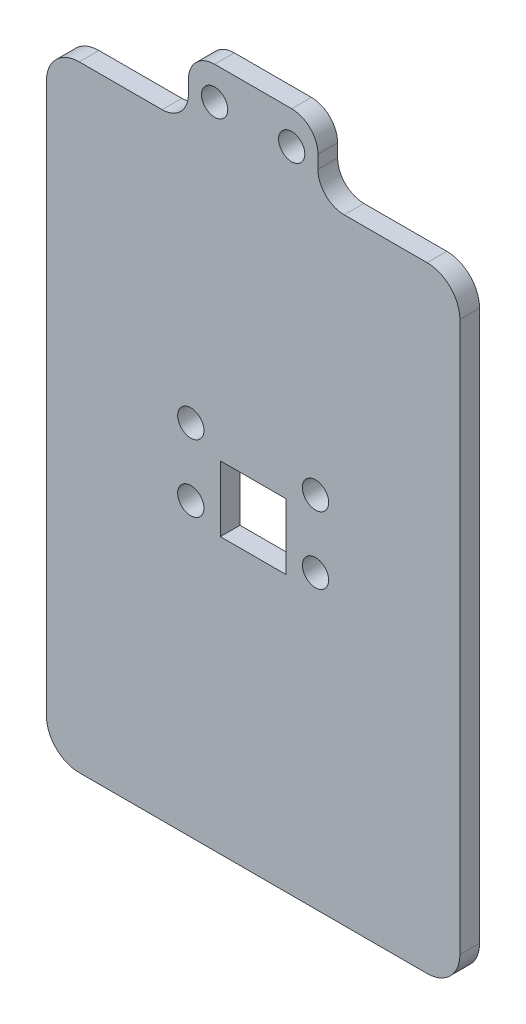
ISO-10303-21;
HEADER;
FILE_DESCRIPTION(('STEP AP214'),'2;1');
FILE_NAME('part.step','',(''),(''),'','','');
FILE_SCHEMA(('AUTOMOTIVE_DESIGN { 1 0 10303 214 1 1 1 1 }'));
ENDSEC;
DATA;
#1=APPLICATION_CONTEXT('core data for automotive mechanical design processes');
#2=APPLICATION_PROTOCOL_DEFINITION('international standard','automotive_design',2000,#1);
#3=PRODUCT_CONTEXT('',#1,'mechanical');
#4=PRODUCT('Part','Part','',(#3));
#5=PRODUCT_RELATED_PRODUCT_CATEGORY('part','',(#4));
#6=PRODUCT_DEFINITION_FORMATION('','',#4);
#7=PRODUCT_DEFINITION_CONTEXT('part definition',#1,'design');
#8=PRODUCT_DEFINITION('design','',#6,#7);
#9=PRODUCT_DEFINITION_SHAPE('','',#8);
#10=(LENGTH_UNIT() NAMED_UNIT(*) SI_UNIT(.MILLI.,.METRE.));
#11=(NAMED_UNIT(*) PLANE_ANGLE_UNIT() SI_UNIT($,.RADIAN.));
#12=(NAMED_UNIT(*) SI_UNIT($,.STERADIAN.) SOLID_ANGLE_UNIT());
#13=UNCERTAINTY_MEASURE_WITH_UNIT(LENGTH_MEASURE(1.E-05),#10,'distance_accuracy_value','');
#14=(GEOMETRIC_REPRESENTATION_CONTEXT(3) GLOBAL_UNCERTAINTY_ASSIGNED_CONTEXT((#13)) GLOBAL_UNIT_ASSIGNED_CONTEXT((#10,
#11,#12)) REPRESENTATION_CONTEXT('',''));
#15=CARTESIAN_POINT('',(0.,0.,0.));
#16=DIRECTION('',(0.,0.,1.));
#17=DIRECTION('',(1.,0.,0.));
#18=AXIS2_PLACEMENT_3D('',#15,#16,#17);
#19=CARTESIAN_POINT('',(-26.5,-41.9,3.));
#20=DIRECTION('',(0.,0.,-1.));
#21=DIRECTION('',(-1.,0.,0.));
#22=AXIS2_PLACEMENT_3D('',#19,#20,#21);
#23=PLANE('',#22);
#24=CARTESIAN_POINT('',(-9.50000000000001,7.75,3.));
#25=DIRECTION('',(0.,0.,1.));
#26=DIRECTION('',(1.,0.,0.));
#27=AXIS2_PLACEMENT_3D('',#24,#25,#26);
#28=CIRCLE('',#27,2.);
#29=CARTESIAN_POINT('',(-7.50000000000001,7.75,3.));
#30=VERTEX_POINT('',#29);
#31=EDGE_CURVE('E650',#30,#30,#28,.T.);
#32=ORIENTED_EDGE('',*,*,#31,.F.);
#33=EDGE_LOOP('',(#32));
#34=FACE_BOUND('',#33,.T.);
#35=CARTESIAN_POINT('',(9.49999999999999,-2.5,3.));
#36=DIRECTION('',(0.,0.,1.));
#37=DIRECTION('',(1.,0.,0.));
#38=AXIS2_PLACEMENT_3D('',#35,#36,#37);
#39=CIRCLE('',#38,2.);
#40=CARTESIAN_POINT('',(11.5,-2.5,3.));
#41=VERTEX_POINT('',#40);
#42=EDGE_CURVE('E662',#41,#41,#39,.T.);
#43=ORIENTED_EDGE('',*,*,#42,.F.);
#44=EDGE_LOOP('',(#43));
#45=FACE_BOUND('',#44,.T.);
#46=CARTESIAN_POINT('',(-5.86967980898232,51.9,3.));
#47=DIRECTION('',(0.,0.,1.));
#48=DIRECTION('',(1.,0.,0.));
#49=AXIS2_PLACEMENT_3D('',#46,#47,#48);
#50=CIRCLE('',#49,2.);
#51=CARTESIAN_POINT('',(-3.86967980898232,51.9,3.));
#52=VERTEX_POINT('',#51);
#53=EDGE_CURVE('E199',#52,#52,#50,.T.);
#54=ORIENTED_EDGE('',*,*,#53,.F.);
#55=EDGE_LOOP('',(#54));
#56=FACE_BOUND('',#55,.T.);
#57=CARTESIAN_POINT('',(-26.5,-41.9,3.));
#58=DIRECTION('',(0.,0.,1.));
#59=DIRECTION('',(-1.,0.,0.));
#60=AXIS2_PLACEMENT_3D('',#57,#58,#59);
#61=CIRCLE('',#60,5.);
#62=CARTESIAN_POINT('',(-31.5,-41.9,3.));
#63=VERTEX_POINT('',#62);
#64=CARTESIAN_POINT('',(-26.5,-46.9,3.));
#65=VERTEX_POINT('',#64);
#66=EDGE_CURVE('E209',#63,#65,#61,.T.);
#67=ORIENTED_EDGE('',*,*,#66,.T.);
#68=DIRECTION('',(1.,0.,0.));
#69=VECTOR('',#68,1.);
#70=CARTESIAN_POINT('',(-26.5,-46.9,3.));
#71=LINE('',#70,#69);
#72=CARTESIAN_POINT('',(26.5,-46.9,3.));
#73=VERTEX_POINT('',#72);
#74=EDGE_CURVE('E212',#65,#73,#71,.T.);
#75=ORIENTED_EDGE('',*,*,#74,.T.);
#76=CARTESIAN_POINT('',(26.5,-41.9,3.));
#77=DIRECTION('',(0.,0.,1.));
#78=DIRECTION('',(1.,0.,0.));
#79=AXIS2_PLACEMENT_3D('',#76,#77,#78);
#80=CIRCLE('',#79,5.);
#81=CARTESIAN_POINT('',(31.5,-41.9,3.));
#82=VERTEX_POINT('',#81);
#83=EDGE_CURVE('E215',#73,#82,#80,.T.);
#84=ORIENTED_EDGE('',*,*,#83,.T.);
#85=DIRECTION('',(0.,1.,0.));
#86=VECTOR('',#85,1.);
#87=CARTESIAN_POINT('',(31.5,-41.9,3.));
#88=LINE('',#87,#86);
#89=CARTESIAN_POINT('',(31.5,41.8999999999999,3.));
#90=VERTEX_POINT('',#89);
#91=EDGE_CURVE('E217',#82,#90,#88,.T.);
#92=ORIENTED_EDGE('',*,*,#91,.T.);
#93=CARTESIAN_POINT('',(26.5,41.9,3.));
#94=DIRECTION('',(0.,0.,1.));
#95=DIRECTION('',(-1.,0.,0.));
#96=AXIS2_PLACEMENT_3D('',#93,#94,#95);
#97=CIRCLE('',#96,5.);
#98=CARTESIAN_POINT('',(26.5,46.9,3.));
#99=VERTEX_POINT('',#98);
#100=EDGE_CURVE('E219',#90,#99,#97,.T.);
#101=ORIENTED_EDGE('',*,*,#100,.T.);
#102=DIRECTION('',(-1.,0.,0.));
#103=VECTOR('',#102,1.);
#104=CARTESIAN_POINT('',(13.8696798089823,46.9,3.));
#105=LINE('',#104,#103);
#106=CARTESIAN_POINT('',(13.8696798089823,46.9,3.));
#107=VERTEX_POINT('',#106);
#108=EDGE_CURVE('E221',#99,#107,#105,.T.);
#109=ORIENTED_EDGE('',*,*,#108,.T.);
#110=CARTESIAN_POINT('',(13.8696798089823,50.9,3.));
#111=DIRECTION('',(0.,0.,-1.));
#112=DIRECTION('',(-1.,0.,0.));
#113=AXIS2_PLACEMENT_3D('',#110,#111,#112);
#114=CIRCLE('',#113,4.);
#115=CARTESIAN_POINT('',(9.86967980898232,50.9,3.));
#116=VERTEX_POINT('',#115);
#117=EDGE_CURVE('E223',#107,#116,#114,.T.);
#118=ORIENTED_EDGE('',*,*,#117,.T.);
#119=DIRECTION('',(0.,1.,0.));
#120=VECTOR('',#119,1.);
#121=CARTESIAN_POINT('',(9.86967980898232,52.9,3.));
#122=LINE('',#121,#120);
#123=CARTESIAN_POINT('',(9.86967980898232,52.9,3.));
#124=VERTEX_POINT('',#123);
#125=EDGE_CURVE('E225',#116,#124,#122,.T.);
#126=ORIENTED_EDGE('',*,*,#125,.T.);
#127=CARTESIAN_POINT('',(5.86967980898232,52.9,3.));
#128=DIRECTION('',(0.,0.,1.));
#129=DIRECTION('',(-1.,0.,0.));
#130=AXIS2_PLACEMENT_3D('',#127,#128,#129);
#131=CIRCLE('',#130,4.);
#132=CARTESIAN_POINT('',(5.86967980898229,56.9,3.));
#133=VERTEX_POINT('',#132);
#134=EDGE_CURVE('E227',#124,#133,#131,.T.);
#135=ORIENTED_EDGE('',*,*,#134,.T.);
#136=DIRECTION('',(-1.,0.,0.));
#137=VECTOR('',#136,1.);
#138=CARTESIAN_POINT('',(-5.86967980898229,56.9,3.));
#139=LINE('',#138,#137);
#140=CARTESIAN_POINT('',(-5.86967980898229,56.9,3.));
#141=VERTEX_POINT('',#140);
#142=EDGE_CURVE('E229',#133,#141,#139,.T.);
#143=ORIENTED_EDGE('',*,*,#142,.T.);
#144=CARTESIAN_POINT('',(-5.86967980898232,52.9,3.));
#145=DIRECTION('',(0.,0.,1.));
#146=DIRECTION('',(1.,0.,0.));
#147=AXIS2_PLACEMENT_3D('',#144,#145,#146);
#148=CIRCLE('',#147,4.);
#149=CARTESIAN_POINT('',(-9.86967980898232,52.9,3.));
#150=VERTEX_POINT('',#149);
#151=EDGE_CURVE('E231',#141,#150,#148,.T.);
#152=ORIENTED_EDGE('',*,*,#151,.T.);
#153=DIRECTION('',(0.,-1.,0.));
#154=VECTOR('',#153,1.);
#155=CARTESIAN_POINT('',(-9.86967980898232,52.9,3.));
#156=LINE('',#155,#154);
#157=CARTESIAN_POINT('',(-9.86967980898232,50.9,3.));
#158=VERTEX_POINT('',#157);
#159=EDGE_CURVE('E233',#150,#158,#156,.T.);
#160=ORIENTED_EDGE('',*,*,#159,.T.);
#161=CARTESIAN_POINT('',(-13.8696798089823,50.9,3.));
#162=DIRECTION('',(0.,0.,-1.));
#163=DIRECTION('',(-1.,0.,0.));
#164=AXIS2_PLACEMENT_3D('',#161,#162,#163);
#165=CIRCLE('',#164,4.);
#166=CARTESIAN_POINT('',(-13.8696798089823,46.9,3.));
#167=VERTEX_POINT('',#166);
#168=EDGE_CURVE('E235',#158,#167,#165,.T.);
#169=ORIENTED_EDGE('',*,*,#168,.T.);
#170=DIRECTION('',(-1.,0.,0.));
#171=VECTOR('',#170,1.);
#172=CARTESIAN_POINT('',(-26.5,46.9,3.));
#173=LINE('',#172,#171);
#174=CARTESIAN_POINT('',(-26.5,46.9,3.));
#175=VERTEX_POINT('',#174);
#176=EDGE_CURVE('E237',#167,#175,#173,.T.);
#177=ORIENTED_EDGE('',*,*,#176,.T.);
#178=CARTESIAN_POINT('',(-26.5,41.9,3.));
#179=DIRECTION('',(0.,0.,1.));
#180=DIRECTION('',(-1.,0.,0.));
#181=AXIS2_PLACEMENT_3D('',#178,#179,#180);
#182=CIRCLE('',#181,5.);
#183=CARTESIAN_POINT('',(-31.5,41.8999999999999,3.));
#184=VERTEX_POINT('',#183);
#185=EDGE_CURVE('E239',#175,#184,#182,.T.);
#186=ORIENTED_EDGE('',*,*,#185,.T.);
#187=DIRECTION('',(0.,-1.,0.));
#188=VECTOR('',#187,1.);
#189=CARTESIAN_POINT('',(-31.5,-41.9,3.));
#190=LINE('',#189,#188);
#191=EDGE_CURVE('E241',#184,#63,#190,.T.);
#192=ORIENTED_EDGE('',*,*,#191,.T.);
#193=EDGE_LOOP('',(#67,#75,#84,#92,#101,#109,#118,#126,#135,#143,#152,#160,#169,#177,#186,#192));
#194=FACE_BOUND('',#193,.T.);
#195=DIRECTION('',(0.,1.,0.));
#196=VECTOR('',#195,1.);
#197=CARTESIAN_POINT('',(4.99999999999999,4.99999999999999,3.));
#198=LINE('',#197,#196);
#199=CARTESIAN_POINT('',(4.99999999999999,-5.00000000000001,3.));
#200=VERTEX_POINT('',#199);
#201=CARTESIAN_POINT('',(4.99999999999999,4.99999999999999,3.));
#202=VERTEX_POINT('',#201);
#203=EDGE_CURVE('E170',#200,#202,#198,.T.);
#204=ORIENTED_EDGE('',*,*,#203,.F.);
#205=DIRECTION('',(1.,0.,0.));
#206=VECTOR('',#205,1.);
#207=CARTESIAN_POINT('',(-5.00000000000001,-5.00000000000001,3.));
#208=LINE('',#207,#206);
#209=CARTESIAN_POINT('',(-5.,-5.,3.));
#210=VERTEX_POINT('',#209);
#211=EDGE_CURVE('E193',#210,#200,#208,.T.);
#212=ORIENTED_EDGE('',*,*,#211,.F.);
#213=DIRECTION('',(0.,-1.,0.));
#214=VECTOR('',#213,1.);
#215=CARTESIAN_POINT('',(-5.00000000000001,4.99999999999999,3.));
#216=LINE('',#215,#214);
#217=CARTESIAN_POINT('',(-5.00000000000001,4.99999999999999,3.));
#218=VERTEX_POINT('',#217);
#219=EDGE_CURVE('E191',#218,#210,#216,.T.);
#220=ORIENTED_EDGE('',*,*,#219,.F.);
#221=DIRECTION('',(-1.,0.,0.));
#222=VECTOR('',#221,1.);
#223=CARTESIAN_POINT('',(-5.00000000000001,4.99999999999999,3.));
#224=LINE('',#223,#222);
#225=EDGE_CURVE('E178',#202,#218,#224,.T.);
#226=ORIENTED_EDGE('',*,*,#225,.F.);
#227=EDGE_LOOP('',(#204,#212,#220,#226));
#228=FACE_BOUND('',#227,.T.);
#229=CARTESIAN_POINT('',(5.86967980898232,51.9,3.));
#230=DIRECTION('',(0.,0.,1.));
#231=DIRECTION('',(1.,0.,0.));
#232=AXIS2_PLACEMENT_3D('',#229,#230,#231);
#233=CIRCLE('',#232,2.);
#234=CARTESIAN_POINT('',(7.86967980898232,51.9,3.));
#235=VERTEX_POINT('',#234);
#236=EDGE_CURVE('E668',#235,#235,#233,.T.);
#237=ORIENTED_EDGE('',*,*,#236,.F.);
#238=EDGE_LOOP('',(#237));
#239=FACE_BOUND('',#238,.T.);
#240=CARTESIAN_POINT('',(-9.50000000000001,-2.5,3.));
#241=DIRECTION('',(0.,0.,1.));
#242=DIRECTION('',(1.,0.,0.));
#243=AXIS2_PLACEMENT_3D('',#240,#241,#242);
#244=CIRCLE('',#243,2.);
#245=CARTESIAN_POINT('',(-7.50000000000001,-2.5,3.));
#246=VERTEX_POINT('',#245);
#247=EDGE_CURVE('E656',#246,#246,#244,.T.);
#248=ORIENTED_EDGE('',*,*,#247,.F.);
#249=EDGE_LOOP('',(#248));
#250=FACE_BOUND('',#249,.T.);
#251=CARTESIAN_POINT('',(9.49999999999999,7.75,3.));
#252=DIRECTION('',(0.,0.,1.));
#253=DIRECTION('',(1.,0.,0.));
#254=AXIS2_PLACEMENT_3D('',#251,#252,#253);
#255=CIRCLE('',#254,2.);
#256=CARTESIAN_POINT('',(11.5,7.75,3.));
#257=VERTEX_POINT('',#256);
#258=EDGE_CURVE('E641',#257,#257,#255,.T.);
#259=ORIENTED_EDGE('',*,*,#258,.F.);
#260=EDGE_LOOP('',(#259));
#261=FACE_BOUND('',#260,.T.);
#262=ADVANCED_FACE('F33',(#34,#45,#56,#194,#228,#239,#250,#261),#23,.F.);
#263=CARTESIAN_POINT('',(-26.5,-41.9,0.));
#264=DIRECTION('',(0.,0.,-1.));
#265=DIRECTION('',(-1.,0.,0.));
#266=AXIS2_PLACEMENT_3D('',#263,#264,#265);
#267=PLANE('',#266);
#268=CARTESIAN_POINT('',(-9.50000000000001,7.75,0.));
#269=DIRECTION('',(0.,0.,1.));
#270=DIRECTION('',(1.,0.,0.));
#271=AXIS2_PLACEMENT_3D('',#268,#269,#270);
#272=CIRCLE('',#271,2.);
#273=CARTESIAN_POINT('',(-7.50000000000001,7.75,0.));
#274=VERTEX_POINT('',#273);
#275=EDGE_CURVE('E647',#274,#274,#272,.T.);
#276=ORIENTED_EDGE('',*,*,#275,.T.);
#277=EDGE_LOOP('',(#276));
#278=FACE_BOUND('',#277,.T.);
#279=CARTESIAN_POINT('',(9.49999999999999,-2.5,0.));
#280=DIRECTION('',(0.,0.,1.));
#281=DIRECTION('',(1.,0.,0.));
#282=AXIS2_PLACEMENT_3D('',#279,#280,#281);
#283=CIRCLE('',#282,2.);
#284=CARTESIAN_POINT('',(11.5,-2.5,0.));
#285=VERTEX_POINT('',#284);
#286=EDGE_CURVE('E659',#285,#285,#283,.T.);
#287=ORIENTED_EDGE('',*,*,#286,.T.);
#288=EDGE_LOOP('',(#287));
#289=FACE_BOUND('',#288,.T.);
#290=CARTESIAN_POINT('',(-5.86967980898232,51.9,0.));
#291=DIRECTION('',(0.,0.,1.));
#292=DIRECTION('',(1.,0.,0.));
#293=AXIS2_PLACEMENT_3D('',#290,#291,#292);
#294=CIRCLE('',#293,2.);
#295=CARTESIAN_POINT('',(-3.86967980898232,51.9,0.));
#296=VERTEX_POINT('',#295);
#297=EDGE_CURVE('E671',#296,#296,#294,.T.);
#298=ORIENTED_EDGE('',*,*,#297,.T.);
#299=EDGE_LOOP('',(#298));
#300=FACE_BOUND('',#299,.T.);
#301=CARTESIAN_POINT('',(-26.5,-41.9,0.));
#302=DIRECTION('',(0.,0.,1.));
#303=DIRECTION('',(-1.,0.,0.));
#304=AXIS2_PLACEMENT_3D('',#301,#302,#303);
#305=CIRCLE('',#304,5.);
#306=CARTESIAN_POINT('',(-31.5,-41.9,0.));
#307=VERTEX_POINT('',#306);
#308=CARTESIAN_POINT('',(-26.5,-46.9,0.));
#309=VERTEX_POINT('',#308);
#310=EDGE_CURVE('E186',#307,#309,#305,.T.);
#311=ORIENTED_EDGE('',*,*,#310,.F.);
#312=DIRECTION('',(0.,-1.,0.));
#313=VECTOR('',#312,1.);
#314=CARTESIAN_POINT('',(-31.5,-41.9,0.));
#315=LINE('',#314,#313);
#316=CARTESIAN_POINT('',(-31.5,41.8999999999999,0.));
#317=VERTEX_POINT('',#316);
#318=EDGE_CURVE('E213',#317,#307,#315,.T.);
#319=ORIENTED_EDGE('',*,*,#318,.F.);
#320=CARTESIAN_POINT('',(-26.5,41.9,0.));
#321=DIRECTION('',(0.,0.,1.));
#322=DIRECTION('',(-1.,0.,0.));
#323=AXIS2_PLACEMENT_3D('',#320,#321,#322);
#324=CIRCLE('',#323,5.);
#325=CARTESIAN_POINT('',(-26.5,46.9,0.));
#326=VERTEX_POINT('',#325);
#327=EDGE_CURVE('E272',#326,#317,#324,.T.);
#328=ORIENTED_EDGE('',*,*,#327,.F.);
#329=DIRECTION('',(-1.,0.,0.));
#330=VECTOR('',#329,1.);
#331=CARTESIAN_POINT('',(-26.5,46.9,0.));
#332=LINE('',#331,#330);
#333=CARTESIAN_POINT('',(-13.8696798089823,46.9,0.));
#334=VERTEX_POINT('',#333);
#335=EDGE_CURVE('E270',#334,#326,#332,.T.);
#336=ORIENTED_EDGE('',*,*,#335,.F.);
#337=CARTESIAN_POINT('',(-13.8696798089823,50.9,0.));
#338=DIRECTION('',(0.,0.,-1.));
#339=DIRECTION('',(-1.,0.,0.));
#340=AXIS2_PLACEMENT_3D('',#337,#338,#339);
#341=CIRCLE('',#340,4.);
#342=CARTESIAN_POINT('',(-9.86967980898232,50.9,0.));
#343=VERTEX_POINT('',#342);
#344=EDGE_CURVE('E268',#343,#334,#341,.T.);
#345=ORIENTED_EDGE('',*,*,#344,.F.);
#346=DIRECTION('',(0.,-1.,0.));
#347=VECTOR('',#346,1.);
#348=CARTESIAN_POINT('',(-9.86967980898232,52.9,0.));
#349=LINE('',#348,#347);
#350=CARTESIAN_POINT('',(-9.86967980898232,52.9,0.));
#351=VERTEX_POINT('',#350);
#352=EDGE_CURVE('E266',#351,#343,#349,.T.);
#353=ORIENTED_EDGE('',*,*,#352,.F.);
#354=CARTESIAN_POINT('',(-5.86967980898232,52.9,0.));
#355=DIRECTION('',(0.,0.,1.));
#356=DIRECTION('',(1.,0.,0.));
#357=AXIS2_PLACEMENT_3D('',#354,#355,#356);
#358=CIRCLE('',#357,4.);
#359=CARTESIAN_POINT('',(-5.86967980898229,56.9,0.));
#360=VERTEX_POINT('',#359);
#361=EDGE_CURVE('E264',#360,#351,#358,.T.);
#362=ORIENTED_EDGE('',*,*,#361,.F.);
#363=DIRECTION('',(-1.,0.,0.));
#364=VECTOR('',#363,1.);
#365=CARTESIAN_POINT('',(-5.86967980898229,56.9,0.));
#366=LINE('',#365,#364);
#367=CARTESIAN_POINT('',(5.86967980898229,56.9,0.));
#368=VERTEX_POINT('',#367);
#369=EDGE_CURVE('E262',#368,#360,#366,.T.);
#370=ORIENTED_EDGE('',*,*,#369,.F.);
#371=CARTESIAN_POINT('',(5.86967980898232,52.9,0.));
#372=DIRECTION('',(0.,0.,1.));
#373=DIRECTION('',(-1.,0.,0.));
#374=AXIS2_PLACEMENT_3D('',#371,#372,#373);
#375=CIRCLE('',#374,4.);
#376=CARTESIAN_POINT('',(9.86967980898232,52.9,0.));
#377=VERTEX_POINT('',#376);
#378=EDGE_CURVE('E260',#377,#368,#375,.T.);
#379=ORIENTED_EDGE('',*,*,#378,.F.);
#380=DIRECTION('',(0.,1.,0.));
#381=VECTOR('',#380,1.);
#382=CARTESIAN_POINT('',(9.86967980898232,52.9,0.));
#383=LINE('',#382,#381);
#384=CARTESIAN_POINT('',(9.86967980898232,50.9,0.));
#385=VERTEX_POINT('',#384);
#386=EDGE_CURVE('E258',#385,#377,#383,.T.);
#387=ORIENTED_EDGE('',*,*,#386,.F.);
#388=CARTESIAN_POINT('',(13.8696798089823,50.9,0.));
#389=DIRECTION('',(0.,0.,-1.));
#390=DIRECTION('',(-1.,0.,0.));
#391=AXIS2_PLACEMENT_3D('',#388,#389,#390);
#392=CIRCLE('',#391,4.);
#393=CARTESIAN_POINT('',(13.8696798089823,46.9,0.));
#394=VERTEX_POINT('',#393);
#395=EDGE_CURVE('E256',#394,#385,#392,.T.);
#396=ORIENTED_EDGE('',*,*,#395,.F.);
#397=DIRECTION('',(-1.,0.,0.));
#398=VECTOR('',#397,1.);
#399=CARTESIAN_POINT('',(13.8696798089823,46.9,0.));
#400=LINE('',#399,#398);
#401=CARTESIAN_POINT('',(26.5,46.9,0.));
#402=VERTEX_POINT('',#401);
#403=EDGE_CURVE('E254',#402,#394,#400,.T.);
#404=ORIENTED_EDGE('',*,*,#403,.F.);
#405=CARTESIAN_POINT('',(26.5,41.9,0.));
#406=DIRECTION('',(0.,0.,1.));
#407=DIRECTION('',(-1.,0.,0.));
#408=AXIS2_PLACEMENT_3D('',#405,#406,#407);
#409=CIRCLE('',#408,5.);
#410=CARTESIAN_POINT('',(31.5,41.8999999999999,0.));
#411=VERTEX_POINT('',#410);
#412=EDGE_CURVE('E252',#411,#402,#409,.T.);
#413=ORIENTED_EDGE('',*,*,#412,.F.);
#414=DIRECTION('',(0.,1.,0.));
#415=VECTOR('',#414,1.);
#416=CARTESIAN_POINT('',(31.5,-41.9,0.));
#417=LINE('',#416,#415);
#418=CARTESIAN_POINT('',(31.5,-41.9,0.));
#419=VERTEX_POINT('',#418);
#420=EDGE_CURVE('E250',#419,#411,#417,.T.);
#421=ORIENTED_EDGE('',*,*,#420,.F.);
#422=CARTESIAN_POINT('',(26.5,-41.9,0.));
#423=DIRECTION('',(0.,0.,1.));
#424=DIRECTION('',(1.,0.,0.));
#425=AXIS2_PLACEMENT_3D('',#422,#423,#424);
#426=CIRCLE('',#425,5.);
#427=CARTESIAN_POINT('',(26.5,-46.9,0.));
#428=VERTEX_POINT('',#427);
#429=EDGE_CURVE('E248',#428,#419,#426,.T.);
#430=ORIENTED_EDGE('',*,*,#429,.F.);
#431=DIRECTION('',(1.,0.,0.));
#432=VECTOR('',#431,1.);
#433=CARTESIAN_POINT('',(-26.5,-46.9,0.));
#434=LINE('',#433,#432);
#435=EDGE_CURVE('E246',#309,#428,#434,.T.);
#436=ORIENTED_EDGE('',*,*,#435,.F.);
#437=EDGE_LOOP('',(#311,#319,#328,#336,#345,#353,#362,#370,#379,#387,#396,#404,#413,#421,#430,#436));
#438=FACE_BOUND('',#437,.T.);
#439=DIRECTION('',(1.,0.,0.));
#440=VECTOR('',#439,1.);
#441=CARTESIAN_POINT('',(-5.00000000000001,-5.00000000000001,0.));
#442=LINE('',#441,#440);
#443=CARTESIAN_POINT('',(-5.00000000000001,-5.00000000000001,0.));
#444=VERTEX_POINT('',#443);
#445=CARTESIAN_POINT('',(4.99999999999999,-5.,0.));
#446=VERTEX_POINT('',#445);
#447=EDGE_CURVE('E179',#444,#446,#442,.T.);
#448=ORIENTED_EDGE('',*,*,#447,.T.);
#449=DIRECTION('',(0.,1.,0.));
#450=VECTOR('',#449,1.);
#451=CARTESIAN_POINT('',(4.99999999999999,4.99999999999999,0.));
#452=LINE('',#451,#450);
#453=CARTESIAN_POINT('',(4.99999999999999,4.99999999999999,0.));
#454=VERTEX_POINT('',#453);
#455=EDGE_CURVE('E56',#446,#454,#452,.T.);
#456=ORIENTED_EDGE('',*,*,#455,.T.);
#457=DIRECTION('',(-1.,0.,0.));
#458=VECTOR('',#457,1.);
#459=CARTESIAN_POINT('',(-5.00000000000001,4.99999999999999,0.));
#460=LINE('',#459,#458);
#461=CARTESIAN_POINT('',(-5.00000000000001,4.99999999999999,0.));
#462=VERTEX_POINT('',#461);
#463=EDGE_CURVE('E185',#454,#462,#460,.T.);
#464=ORIENTED_EDGE('',*,*,#463,.T.);
#465=DIRECTION('',(0.,-1.,0.));
#466=VECTOR('',#465,1.);
#467=CARTESIAN_POINT('',(-5.00000000000001,4.99999999999999,0.));
#468=LINE('',#467,#466);
#469=EDGE_CURVE('E201',#462,#444,#468,.T.);
#470=ORIENTED_EDGE('',*,*,#469,.T.);
#471=EDGE_LOOP('',(#448,#456,#464,#470));
#472=FACE_BOUND('',#471,.T.);
#473=CARTESIAN_POINT('',(5.86967980898232,51.9,0.));
#474=DIRECTION('',(0.,0.,1.));
#475=DIRECTION('',(1.,0.,0.));
#476=AXIS2_PLACEMENT_3D('',#473,#474,#475);
#477=CIRCLE('',#476,2.);
#478=CARTESIAN_POINT('',(7.86967980898232,51.9,0.));
#479=VERTEX_POINT('',#478);
#480=EDGE_CURVE('E665',#479,#479,#477,.T.);
#481=ORIENTED_EDGE('',*,*,#480,.T.);
#482=EDGE_LOOP('',(#481));
#483=FACE_BOUND('',#482,.T.);
#484=CARTESIAN_POINT('',(-9.50000000000001,-2.5,0.));
#485=DIRECTION('',(0.,0.,1.));
#486=DIRECTION('',(1.,0.,0.));
#487=AXIS2_PLACEMENT_3D('',#484,#485,#486);
#488=CIRCLE('',#487,2.);
#489=CARTESIAN_POINT('',(-7.50000000000001,-2.5,0.));
#490=VERTEX_POINT('',#489);
#491=EDGE_CURVE('E653',#490,#490,#488,.T.);
#492=ORIENTED_EDGE('',*,*,#491,.T.);
#493=EDGE_LOOP('',(#492));
#494=FACE_BOUND('',#493,.T.);
#495=CARTESIAN_POINT('',(9.49999999999999,7.75,0.));
#496=DIRECTION('',(0.,0.,1.));
#497=DIRECTION('',(1.,0.,0.));
#498=AXIS2_PLACEMENT_3D('',#495,#496,#497);
#499=CIRCLE('',#498,2.);
#500=CARTESIAN_POINT('',(11.5,7.75,0.));
#501=VERTEX_POINT('',#500);
#502=EDGE_CURVE('E644',#501,#501,#499,.T.);
#503=ORIENTED_EDGE('',*,*,#502,.T.);
#504=EDGE_LOOP('',(#503));
#505=FACE_BOUND('',#504,.T.);
#506=ADVANCED_FACE('F326',(#278,#289,#300,#438,#472,#483,#494,#505),#267,.T.);
#507=CARTESIAN_POINT('',(-26.5,-41.9,3.));
#508=DIRECTION('',(0.,0.,-1.));
#509=DIRECTION('',(-1.,0.,0.));
#510=AXIS2_PLACEMENT_3D('',#507,#508,#509);
#511=CYLINDRICAL_SURFACE('',#510,5.);
#512=ORIENTED_EDGE('',*,*,#310,.T.);
#513=DIRECTION('',(0.,0.,-1.));
#514=VECTOR('',#513,1.);
#515=CARTESIAN_POINT('',(-26.5,-46.9,3.));
#516=LINE('',#515,#514);
#517=EDGE_CURVE('E11',#65,#309,#516,.T.);
#518=ORIENTED_EDGE('',*,*,#517,.F.);
#519=ORIENTED_EDGE('',*,*,#66,.F.);
#520=DIRECTION('',(0.,0.,-1.));
#521=VECTOR('',#520,1.);
#522=CARTESIAN_POINT('',(-31.5,-41.9,3.));
#523=LINE('',#522,#521);
#524=EDGE_CURVE('E243',#63,#307,#523,.T.);
#525=ORIENTED_EDGE('',*,*,#524,.T.);
#526=EDGE_LOOP('',(#512,#518,#519,#525));
#527=FACE_BOUND('',#526,.T.);
#528=ADVANCED_FACE('F35',(#527),#511,.T.);
#529=CARTESIAN_POINT('',(-26.5,-46.9,3.));
#530=DIRECTION('',(0.,1.,0.));
#531=DIRECTION('',(0.,0.,1.));
#532=AXIS2_PLACEMENT_3D('',#529,#530,#531);
#533=PLANE('',#532);
#534=ORIENTED_EDGE('',*,*,#435,.T.);
#535=DIRECTION('',(0.,0.,-1.));
#536=VECTOR('',#535,1.);
#537=CARTESIAN_POINT('',(26.5,-46.9,3.));
#538=LINE('',#537,#536);
#539=EDGE_CURVE('E41',#73,#428,#538,.T.);
#540=ORIENTED_EDGE('',*,*,#539,.F.);
#541=ORIENTED_EDGE('',*,*,#74,.F.);
#542=ORIENTED_EDGE('',*,*,#517,.T.);
#543=EDGE_LOOP('',(#534,#540,#541,#542));
#544=FACE_BOUND('',#543,.T.);
#545=ADVANCED_FACE('F343',(#544),#533,.F.);
#546=CARTESIAN_POINT('',(26.5,-41.9,3.));
#547=DIRECTION('',(0.,0.,-1.));
#548=DIRECTION('',(-1.,0.,0.));
#549=AXIS2_PLACEMENT_3D('',#546,#547,#548);
#550=CYLINDRICAL_SURFACE('',#549,5.);
#551=ORIENTED_EDGE('',*,*,#429,.T.);
#552=DIRECTION('',(0.,0.,-1.));
#553=VECTOR('',#552,1.);
#554=CARTESIAN_POINT('',(31.5,-41.9,3.));
#555=LINE('',#554,#553);
#556=EDGE_CURVE('E313',#82,#419,#555,.T.);
#557=ORIENTED_EDGE('',*,*,#556,.F.);
#558=ORIENTED_EDGE('',*,*,#83,.F.);
#559=ORIENTED_EDGE('',*,*,#539,.T.);
#560=EDGE_LOOP('',(#551,#557,#558,#559));
#561=FACE_BOUND('',#560,.T.);
#562=ADVANCED_FACE('F320',(#561),#550,.T.);
#563=CARTESIAN_POINT('',(31.5,-41.9,3.));
#564=DIRECTION('',(-1.,0.,0.));
#565=DIRECTION('',(0.,0.,1.));
#566=AXIS2_PLACEMENT_3D('',#563,#564,#565);
#567=PLANE('',#566);
#568=ORIENTED_EDGE('',*,*,#420,.T.);
#569=DIRECTION('',(0.,0.,-1.));
#570=VECTOR('',#569,1.);
#571=CARTESIAN_POINT('',(31.5,41.8999999999999,3.));
#572=LINE('',#571,#570);
#573=EDGE_CURVE('E310',#90,#411,#572,.T.);
#574=ORIENTED_EDGE('',*,*,#573,.F.);
#575=ORIENTED_EDGE('',*,*,#91,.F.);
#576=ORIENTED_EDGE('',*,*,#556,.T.);
#577=EDGE_LOOP('',(#568,#574,#575,#576));
#578=FACE_BOUND('',#577,.T.);
#579=ADVANCED_FACE('F332',(#578),#567,.F.);
#580=CARTESIAN_POINT('',(26.5,41.9,3.));
#581=DIRECTION('',(0.,0.,-1.));
#582=DIRECTION('',(-1.,0.,0.));
#583=AXIS2_PLACEMENT_3D('',#580,#581,#582);
#584=CYLINDRICAL_SURFACE('',#583,5.);
#585=ORIENTED_EDGE('',*,*,#412,.T.);
#586=DIRECTION('',(0.,0.,-1.));
#587=VECTOR('',#586,1.);
#588=CARTESIAN_POINT('',(26.5,46.9,3.));
#589=LINE('',#588,#587);
#590=EDGE_CURVE('E307',#99,#402,#589,.T.);
#591=ORIENTED_EDGE('',*,*,#590,.F.);
#592=ORIENTED_EDGE('',*,*,#100,.F.);
#593=ORIENTED_EDGE('',*,*,#573,.T.);
#594=EDGE_LOOP('',(#585,#591,#592,#593));
#595=FACE_BOUND('',#594,.T.);
#596=ADVANCED_FACE('F336',(#595),#584,.T.);
#597=CARTESIAN_POINT('',(13.8696798089823,46.9,3.));
#598=DIRECTION('',(0.,-1.,0.));
#599=DIRECTION('',(0.,0.,-1.));
#600=AXIS2_PLACEMENT_3D('',#597,#598,#599);
#601=PLANE('',#600);
#602=ORIENTED_EDGE('',*,*,#403,.T.);
#603=DIRECTION('',(0.,0.,-1.));
#604=VECTOR('',#603,1.);
#605=CARTESIAN_POINT('',(13.8696798089823,46.9,3.));
#606=LINE('',#605,#604);
#607=EDGE_CURVE('E304',#107,#394,#606,.T.);
#608=ORIENTED_EDGE('',*,*,#607,.F.);
#609=ORIENTED_EDGE('',*,*,#108,.F.);
#610=ORIENTED_EDGE('',*,*,#590,.T.);
#611=EDGE_LOOP('',(#602,#608,#609,#610));
#612=FACE_BOUND('',#611,.T.);
#613=ADVANCED_FACE('F396',(#612),#601,.F.);
#614=CARTESIAN_POINT('',(13.8696798089823,50.9,3.));
#615=DIRECTION('',(0.,0.,-1.));
#616=DIRECTION('',(-1.,0.,0.));
#617=AXIS2_PLACEMENT_3D('',#614,#615,#616);
#618=CYLINDRICAL_SURFACE('',#617,4.);
#619=ORIENTED_EDGE('',*,*,#395,.T.);
#620=DIRECTION('',(0.,0.,-1.));
#621=VECTOR('',#620,1.);
#622=CARTESIAN_POINT('',(9.86967980898232,50.9,3.));
#623=LINE('',#622,#621);
#624=EDGE_CURVE('E301',#116,#385,#623,.T.);
#625=ORIENTED_EDGE('',*,*,#624,.F.);
#626=ORIENTED_EDGE('',*,*,#117,.F.);
#627=ORIENTED_EDGE('',*,*,#607,.T.);
#628=EDGE_LOOP('',(#619,#625,#626,#627));
#629=FACE_BOUND('',#628,.T.);
#630=ADVANCED_FACE('F393',(#629),#618,.F.);
#631=CARTESIAN_POINT('',(9.86967980898232,52.9,3.));
#632=DIRECTION('',(-1.,0.,0.));
#633=DIRECTION('',(0.,0.,1.));
#634=AXIS2_PLACEMENT_3D('',#631,#632,#633);
#635=PLANE('',#634);
#636=ORIENTED_EDGE('',*,*,#386,.T.);
#637=DIRECTION('',(0.,0.,-1.));
#638=VECTOR('',#637,1.);
#639=CARTESIAN_POINT('',(9.86967980898232,52.9,3.));
#640=LINE('',#639,#638);
#641=EDGE_CURVE('E298',#124,#377,#640,.T.);
#642=ORIENTED_EDGE('',*,*,#641,.F.);
#643=ORIENTED_EDGE('',*,*,#125,.F.);
#644=ORIENTED_EDGE('',*,*,#624,.T.);
#645=EDGE_LOOP('',(#636,#642,#643,#644));
#646=FACE_BOUND('',#645,.T.);
#647=ADVANCED_FACE('F389',(#646),#635,.F.);
#648=CARTESIAN_POINT('',(5.86967980898232,52.9,3.));
#649=DIRECTION('',(0.,0.,-1.));
#650=DIRECTION('',(-1.,0.,0.));
#651=AXIS2_PLACEMENT_3D('',#648,#649,#650);
#652=CYLINDRICAL_SURFACE('',#651,4.);
#653=ORIENTED_EDGE('',*,*,#378,.T.);
#654=DIRECTION('',(0.,0.,-1.));
#655=VECTOR('',#654,1.);
#656=CARTESIAN_POINT('',(5.86967980898229,56.9,3.));
#657=LINE('',#656,#655);
#658=EDGE_CURVE('E295',#133,#368,#657,.T.);
#659=ORIENTED_EDGE('',*,*,#658,.F.);
#660=ORIENTED_EDGE('',*,*,#134,.F.);
#661=ORIENTED_EDGE('',*,*,#641,.T.);
#662=EDGE_LOOP('',(#653,#659,#660,#661));
#663=FACE_BOUND('',#662,.T.);
#664=ADVANCED_FACE('F385',(#663),#652,.T.);
#665=CARTESIAN_POINT('',(-5.86967980898229,56.9,3.));
#666=DIRECTION('',(0.,-1.,0.));
#667=DIRECTION('',(0.,0.,-1.));
#668=AXIS2_PLACEMENT_3D('',#665,#666,#667);
#669=PLANE('',#668);
#670=ORIENTED_EDGE('',*,*,#369,.T.);
#671=DIRECTION('',(0.,0.,-1.));
#672=VECTOR('',#671,1.);
#673=CARTESIAN_POINT('',(-5.86967980898229,56.9,3.));
#674=LINE('',#673,#672);
#675=EDGE_CURVE('E292',#141,#360,#674,.T.);
#676=ORIENTED_EDGE('',*,*,#675,.F.);
#677=ORIENTED_EDGE('',*,*,#142,.F.);
#678=ORIENTED_EDGE('',*,*,#658,.T.);
#679=EDGE_LOOP('',(#670,#676,#677,#678));
#680=FACE_BOUND('',#679,.T.);
#681=ADVANCED_FACE('F380',(#680),#669,.F.);
#682=CARTESIAN_POINT('',(-5.86967980898232,52.9,3.));
#683=DIRECTION('',(0.,0.,-1.));
#684=DIRECTION('',(-1.,0.,0.));
#685=AXIS2_PLACEMENT_3D('',#682,#683,#684);
#686=CYLINDRICAL_SURFACE('',#685,4.);
#687=ORIENTED_EDGE('',*,*,#361,.T.);
#688=DIRECTION('',(0.,0.,-1.));
#689=VECTOR('',#688,1.);
#690=CARTESIAN_POINT('',(-9.86967980898232,52.9,3.));
#691=LINE('',#690,#689);
#692=EDGE_CURVE('E289',#150,#351,#691,.T.);
#693=ORIENTED_EDGE('',*,*,#692,.F.);
#694=ORIENTED_EDGE('',*,*,#151,.F.);
#695=ORIENTED_EDGE('',*,*,#675,.T.);
#696=EDGE_LOOP('',(#687,#693,#694,#695));
#697=FACE_BOUND('',#696,.T.);
#698=ADVANCED_FACE('F374',(#697),#686,.T.);
#699=CARTESIAN_POINT('',(-9.86967980898232,52.9,3.));
#700=DIRECTION('',(1.,0.,0.));
#701=DIRECTION('',(0.,0.,-1.));
#702=AXIS2_PLACEMENT_3D('',#699,#700,#701);
#703=PLANE('',#702);
#704=ORIENTED_EDGE('',*,*,#352,.T.);
#705=DIRECTION('',(0.,0.,-1.));
#706=VECTOR('',#705,1.);
#707=CARTESIAN_POINT('',(-9.86967980898232,50.9,3.));
#708=LINE('',#707,#706);
#709=EDGE_CURVE('E286',#158,#343,#708,.T.);
#710=ORIENTED_EDGE('',*,*,#709,.F.);
#711=ORIENTED_EDGE('',*,*,#159,.F.);
#712=ORIENTED_EDGE('',*,*,#692,.T.);
#713=EDGE_LOOP('',(#704,#710,#711,#712));
#714=FACE_BOUND('',#713,.T.);
#715=ADVANCED_FACE('F370',(#714),#703,.F.);
#716=CARTESIAN_POINT('',(-13.8696798089823,50.9,3.));
#717=DIRECTION('',(0.,0.,-1.));
#718=DIRECTION('',(-1.,0.,0.));
#719=AXIS2_PLACEMENT_3D('',#716,#717,#718);
#720=CYLINDRICAL_SURFACE('',#719,4.);
#721=ORIENTED_EDGE('',*,*,#344,.T.);
#722=DIRECTION('',(0.,0.,-1.));
#723=VECTOR('',#722,1.);
#724=CARTESIAN_POINT('',(-13.8696798089823,46.9,3.));
#725=LINE('',#724,#723);
#726=EDGE_CURVE('E283',#167,#334,#725,.T.);
#727=ORIENTED_EDGE('',*,*,#726,.F.);
#728=ORIENTED_EDGE('',*,*,#168,.F.);
#729=ORIENTED_EDGE('',*,*,#709,.T.);
#730=EDGE_LOOP('',(#721,#727,#728,#729));
#731=FACE_BOUND('',#730,.T.);
#732=ADVANCED_FACE('F365',(#731),#720,.F.);
#733=CARTESIAN_POINT('',(-26.5,46.9,3.));
#734=DIRECTION('',(0.,-1.,0.));
#735=DIRECTION('',(0.,0.,-1.));
#736=AXIS2_PLACEMENT_3D('',#733,#734,#735);
#737=PLANE('',#736);
#738=ORIENTED_EDGE('',*,*,#335,.T.);
#739=DIRECTION('',(0.,0.,-1.));
#740=VECTOR('',#739,1.);
#741=CARTESIAN_POINT('',(-26.5,46.9,3.));
#742=LINE('',#741,#740);
#743=EDGE_CURVE('E280',#175,#326,#742,.T.);
#744=ORIENTED_EDGE('',*,*,#743,.F.);
#745=ORIENTED_EDGE('',*,*,#176,.F.);
#746=ORIENTED_EDGE('',*,*,#726,.T.);
#747=EDGE_LOOP('',(#738,#744,#745,#746));
#748=FACE_BOUND('',#747,.T.);
#749=ADVANCED_FACE('F359',(#748),#737,.F.);
#750=CARTESIAN_POINT('',(-26.5,41.9,3.));
#751=DIRECTION('',(0.,0.,-1.));
#752=DIRECTION('',(-1.,0.,0.));
#753=AXIS2_PLACEMENT_3D('',#750,#751,#752);
#754=CYLINDRICAL_SURFACE('',#753,5.);
#755=ORIENTED_EDGE('',*,*,#327,.T.);
#756=DIRECTION('',(0.,0.,-1.));
#757=VECTOR('',#756,1.);
#758=CARTESIAN_POINT('',(-31.5,41.8999999999999,3.));
#759=LINE('',#758,#757);
#760=EDGE_CURVE('E277',#184,#317,#759,.T.);
#761=ORIENTED_EDGE('',*,*,#760,.F.);
#762=ORIENTED_EDGE('',*,*,#185,.F.);
#763=ORIENTED_EDGE('',*,*,#743,.T.);
#764=EDGE_LOOP('',(#755,#761,#762,#763));
#765=FACE_BOUND('',#764,.T.);
#766=ADVANCED_FACE('F355',(#765),#754,.T.);
#767=CARTESIAN_POINT('',(-31.5,-41.9,3.));
#768=DIRECTION('',(1.,0.,0.));
#769=DIRECTION('',(0.,0.,-1.));
#770=AXIS2_PLACEMENT_3D('',#767,#768,#769);
#771=PLANE('',#770);
#772=ORIENTED_EDGE('',*,*,#318,.T.);
#773=ORIENTED_EDGE('',*,*,#524,.F.);
#774=ORIENTED_EDGE('',*,*,#191,.F.);
#775=ORIENTED_EDGE('',*,*,#760,.T.);
#776=EDGE_LOOP('',(#772,#773,#774,#775));
#777=FACE_BOUND('',#776,.T.);
#778=ADVANCED_FACE('F350',(#777),#771,.F.);
#779=CARTESIAN_POINT('',(4.99999999999999,4.99999999999999,3.));
#780=DIRECTION('',(-1.,0.,0.));
#781=DIRECTION('',(0.,-1.,0.));
#782=AXIS2_PLACEMENT_3D('',#779,#780,#781);
#783=PLANE('',#782);
#784=ORIENTED_EDGE('',*,*,#455,.F.);
#785=DIRECTION('',(0.,0.,-1.));
#786=VECTOR('',#785,1.);
#787=CARTESIAN_POINT('',(4.99999999999999,-5.00000000000001,3.));
#788=LINE('',#787,#786);
#789=EDGE_CURVE('E174',#200,#446,#788,.T.);
#790=ORIENTED_EDGE('',*,*,#789,.F.);
#791=ORIENTED_EDGE('',*,*,#203,.T.);
#792=DIRECTION('',(0.,0.,-1.));
#793=VECTOR('',#792,1.);
#794=CARTESIAN_POINT('',(4.99999999999999,4.99999999999999,3.));
#795=LINE('',#794,#793);
#796=EDGE_CURVE('E173',#202,#454,#795,.T.);
#797=ORIENTED_EDGE('',*,*,#796,.T.);
#798=EDGE_LOOP('',(#784,#790,#791,#797));
#799=FACE_BOUND('',#798,.T.);
#800=ADVANCED_FACE('F172',(#799),#783,.T.);
#801=CARTESIAN_POINT('',(-5.00000000000001,4.99999999999999,3.));
#802=DIRECTION('',(0.,-1.,0.));
#803=DIRECTION('',(0.,0.,-1.));
#804=AXIS2_PLACEMENT_3D('',#801,#802,#803);
#805=PLANE('',#804);
#806=ORIENTED_EDGE('',*,*,#463,.F.);
#807=ORIENTED_EDGE('',*,*,#796,.F.);
#808=ORIENTED_EDGE('',*,*,#225,.T.);
#809=DIRECTION('',(0.,0.,-1.));
#810=VECTOR('',#809,1.);
#811=CARTESIAN_POINT('',(-5.00000000000001,4.99999999999999,3.));
#812=LINE('',#811,#810);
#813=EDGE_CURVE('E187',#218,#462,#812,.T.);
#814=ORIENTED_EDGE('',*,*,#813,.T.);
#815=EDGE_LOOP('',(#806,#807,#808,#814));
#816=FACE_BOUND('',#815,.T.);
#817=ADVANCED_FACE('F182',(#816),#805,.T.);
#818=CARTESIAN_POINT('',(-5.00000000000001,4.99999999999999,3.));
#819=DIRECTION('',(1.,0.,0.));
#820=DIRECTION('',(0.,1.,0.));
#821=AXIS2_PLACEMENT_3D('',#818,#819,#820);
#822=PLANE('',#821);
#823=ORIENTED_EDGE('',*,*,#469,.F.);
#824=ORIENTED_EDGE('',*,*,#813,.F.);
#825=ORIENTED_EDGE('',*,*,#219,.T.);
#826=DIRECTION('',(0.,0.,-1.));
#827=VECTOR('',#826,1.);
#828=CARTESIAN_POINT('',(-5.00000000000001,-5.00000000000001,3.));
#829=LINE('',#828,#827);
#830=EDGE_CURVE('E48',#210,#444,#829,.T.);
#831=ORIENTED_EDGE('',*,*,#830,.T.);
#832=EDGE_LOOP('',(#823,#824,#825,#831));
#833=FACE_BOUND('',#832,.T.);
#834=ADVANCED_FACE('F482',(#833),#822,.T.);
#835=CARTESIAN_POINT('',(-5.00000000000001,-5.00000000000001,3.));
#836=DIRECTION('',(0.,1.,0.));
#837=DIRECTION('',(0.,0.,1.));
#838=AXIS2_PLACEMENT_3D('',#835,#836,#837);
#839=PLANE('',#838);
#840=ORIENTED_EDGE('',*,*,#447,.F.);
#841=ORIENTED_EDGE('',*,*,#830,.F.);
#842=ORIENTED_EDGE('',*,*,#211,.T.);
#843=ORIENTED_EDGE('',*,*,#789,.T.);
#844=EDGE_LOOP('',(#840,#841,#842,#843));
#845=FACE_BOUND('',#844,.T.);
#846=ADVANCED_FACE('F488',(#845),#839,.T.);
#847=CARTESIAN_POINT('',(-5.86967980898232,51.9,3.));
#848=DIRECTION('',(0.,0.,-1.));
#849=DIRECTION('',(-1.,0.,0.));
#850=AXIS2_PLACEMENT_3D('',#847,#848,#849);
#851=CYLINDRICAL_SURFACE('',#850,2.);
#852=ORIENTED_EDGE('',*,*,#53,.T.);
#853=EDGE_LOOP('',(#852));
#854=FACE_BOUND('',#853,.T.);
#855=ORIENTED_EDGE('',*,*,#297,.F.);
#856=EDGE_LOOP('',(#855));
#857=FACE_BOUND('',#856,.T.);
#858=ADVANCED_FACE('F496',(#854,#857),#851,.F.);
#859=CARTESIAN_POINT('',(5.86967980898232,51.9,3.));
#860=DIRECTION('',(0.,0.,-1.));
#861=DIRECTION('',(-1.,0.,0.));
#862=AXIS2_PLACEMENT_3D('',#859,#860,#861);
#863=CYLINDRICAL_SURFACE('',#862,2.);
#864=ORIENTED_EDGE('',*,*,#236,.T.);
#865=EDGE_LOOP('',(#864));
#866=FACE_BOUND('',#865,.T.);
#867=ORIENTED_EDGE('',*,*,#480,.F.);
#868=EDGE_LOOP('',(#867));
#869=FACE_BOUND('',#868,.T.);
#870=ADVANCED_FACE('F503',(#866,#869),#863,.F.);
#871=CARTESIAN_POINT('',(9.49999999999999,-2.5,3.));
#872=DIRECTION('',(0.,0.,-1.));
#873=DIRECTION('',(-1.,0.,0.));
#874=AXIS2_PLACEMENT_3D('',#871,#872,#873);
#875=CYLINDRICAL_SURFACE('',#874,2.);
#876=ORIENTED_EDGE('',*,*,#42,.T.);
#877=EDGE_LOOP('',(#876));
#878=FACE_BOUND('',#877,.T.);
#879=ORIENTED_EDGE('',*,*,#286,.F.);
#880=EDGE_LOOP('',(#879));
#881=FACE_BOUND('',#880,.T.);
#882=ADVANCED_FACE('F511',(#878,#881),#875,.F.);
#883=CARTESIAN_POINT('',(-9.50000000000001,-2.5,3.));
#884=DIRECTION('',(0.,0.,-1.));
#885=DIRECTION('',(-1.,0.,0.));
#886=AXIS2_PLACEMENT_3D('',#883,#884,#885);
#887=CYLINDRICAL_SURFACE('',#886,2.);
#888=ORIENTED_EDGE('',*,*,#247,.T.);
#889=EDGE_LOOP('',(#888));
#890=FACE_BOUND('',#889,.T.);
#891=ORIENTED_EDGE('',*,*,#491,.F.);
#892=EDGE_LOOP('',(#891));
#893=FACE_BOUND('',#892,.T.);
#894=ADVANCED_FACE('F519',(#890,#893),#887,.F.);
#895=CARTESIAN_POINT('',(-9.50000000000001,7.75,3.));
#896=DIRECTION('',(0.,0.,-1.));
#897=DIRECTION('',(-1.,0.,0.));
#898=AXIS2_PLACEMENT_3D('',#895,#896,#897);
#899=CYLINDRICAL_SURFACE('',#898,2.);
#900=ORIENTED_EDGE('',*,*,#31,.T.);
#901=EDGE_LOOP('',(#900));
#902=FACE_BOUND('',#901,.T.);
#903=ORIENTED_EDGE('',*,*,#275,.F.);
#904=EDGE_LOOP('',(#903));
#905=FACE_BOUND('',#904,.T.);
#906=ADVANCED_FACE('F527',(#902,#905),#899,.F.);
#907=CARTESIAN_POINT('',(9.49999999999999,7.75,3.));
#908=DIRECTION('',(0.,0.,-1.));
#909=DIRECTION('',(-1.,0.,0.));
#910=AXIS2_PLACEMENT_3D('',#907,#908,#909);
#911=CYLINDRICAL_SURFACE('',#910,2.);
#912=ORIENTED_EDGE('',*,*,#258,.T.);
#913=EDGE_LOOP('',(#912));
#914=FACE_BOUND('',#913,.T.);
#915=ORIENTED_EDGE('',*,*,#502,.F.);
#916=EDGE_LOOP('',(#915));
#917=FACE_BOUND('',#916,.T.);
#918=ADVANCED_FACE('F535',(#914,#917),#911,.F.);
#919=CLOSED_SHELL('',(#262,#506,#528,#545,#562,#579,#596,#613,#630,#647,#664,#681,#698,#715,
#732,#749,#766,#778,#800,#817,#834,#846,#858,#870,#882,#894,#906,#918));
#920=MANIFOLD_SOLID_BREP('B2',#919);
#921=ADVANCED_BREP_SHAPE_REPRESENTATION('',(#18,#920),#14);
#922=SHAPE_DEFINITION_REPRESENTATION(#9,#921);
ENDSEC;
END-ISO-10303-21;
